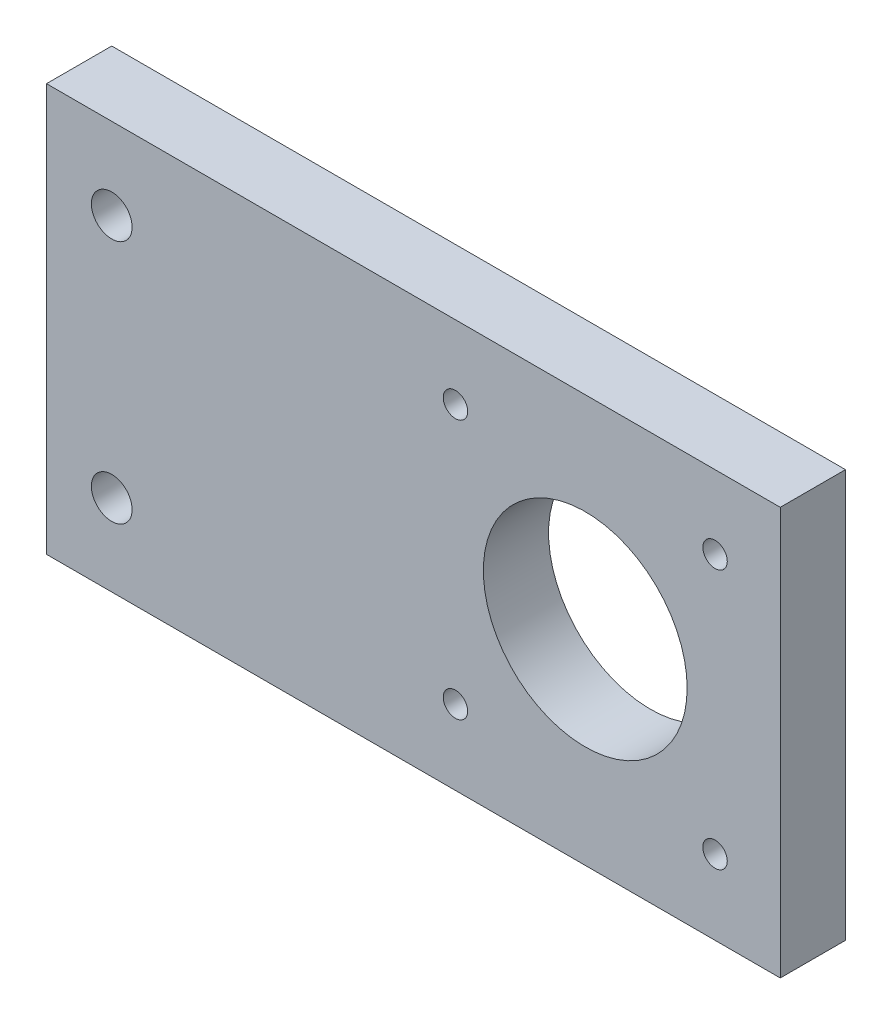
ISO-10303-21;
HEADER;
FILE_DESCRIPTION(('STEP AP214'),'2;1');
FILE_NAME('part.step','',(''),(''),'','','');
FILE_SCHEMA(('AUTOMOTIVE_DESIGN { 1 0 10303 214 1 1 1 1 }'));
ENDSEC;
DATA;
#1=APPLICATION_CONTEXT('core data for automotive mechanical design processes');
#2=APPLICATION_PROTOCOL_DEFINITION('international standard','automotive_design',2000,#1);
#3=PRODUCT_CONTEXT('',#1,'mechanical');
#4=PRODUCT('Part','Part','',(#3));
#5=PRODUCT_RELATED_PRODUCT_CATEGORY('part','',(#4));
#6=PRODUCT_DEFINITION_FORMATION('','',#4);
#7=PRODUCT_DEFINITION_CONTEXT('part definition',#1,'design');
#8=PRODUCT_DEFINITION('design','',#6,#7);
#9=PRODUCT_DEFINITION_SHAPE('','',#8);
#10=(LENGTH_UNIT() NAMED_UNIT(*) SI_UNIT(.MILLI.,.METRE.));
#11=(NAMED_UNIT(*) PLANE_ANGLE_UNIT() SI_UNIT($,.RADIAN.));
#12=(NAMED_UNIT(*) SI_UNIT($,.STERADIAN.) SOLID_ANGLE_UNIT());
#13=UNCERTAINTY_MEASURE_WITH_UNIT(LENGTH_MEASURE(1.E-05),#10,'distance_accuracy_value','');
#14=(GEOMETRIC_REPRESENTATION_CONTEXT(3) GLOBAL_UNCERTAINTY_ASSIGNED_CONTEXT((#13)) GLOBAL_UNIT_ASSIGNED_CONTEXT((#10,
#11,#12)) REPRESENTATION_CONTEXT('',''));
#15=CARTESIAN_POINT('',(0.,0.,0.));
#16=DIRECTION('',(0.,0.,1.));
#17=DIRECTION('',(1.,0.,0.));
#18=AXIS2_PLACEMENT_3D('',#15,#16,#17);
#19=CARTESIAN_POINT('',(44.9999999999999,-25.,8.));
#20=DIRECTION('',(-1.,0.,0.));
#21=DIRECTION('',(0.,0.,1.));
#22=AXIS2_PLACEMENT_3D('',#19,#20,#21);
#23=PLANE('',#22);
#24=DIRECTION('',(0.,1.,0.));
#25=VECTOR('',#24,1.);
#26=CARTESIAN_POINT('',(44.9999999999999,-25.,0.));
#27=LINE('',#26,#25);
#28=CARTESIAN_POINT('',(44.9999999999999,-25.,0.));
#29=VERTEX_POINT('',#28);
#30=CARTESIAN_POINT('',(44.9999999999999,25.,0.));
#31=VERTEX_POINT('',#30);
#32=EDGE_CURVE('E105',#29,#31,#27,.T.);
#33=ORIENTED_EDGE('',*,*,#32,.T.);
#34=DIRECTION('',(0.,0.,-1.));
#35=VECTOR('',#34,1.);
#36=CARTESIAN_POINT('',(44.9999999999999,25.,8.));
#37=LINE('',#36,#35);
#38=CARTESIAN_POINT('',(44.9999999999999,25.,8.));
#39=VERTEX_POINT('',#38);
#40=EDGE_CURVE('E11',#39,#31,#37,.T.);
#41=ORIENTED_EDGE('',*,*,#40,.F.);
#42=DIRECTION('',(0.,1.,0.));
#43=VECTOR('',#42,1.);
#44=CARTESIAN_POINT('',(44.9999999999999,-25.,8.));
#45=LINE('',#44,#43);
#46=CARTESIAN_POINT('',(44.9999999999999,-25.,8.));
#47=VERTEX_POINT('',#46);
#48=EDGE_CURVE('E88',#47,#39,#45,.T.);
#49=ORIENTED_EDGE('',*,*,#48,.F.);
#50=DIRECTION('',(0.,0.,-1.));
#51=VECTOR('',#50,1.);
#52=CARTESIAN_POINT('',(44.9999999999999,-25.,8.));
#53=LINE('',#52,#51);
#54=EDGE_CURVE('E101',#47,#29,#53,.T.);
#55=ORIENTED_EDGE('',*,*,#54,.T.);
#56=EDGE_LOOP('',(#33,#41,#49,#55));
#57=FACE_BOUND('',#56,.T.);
#58=ADVANCED_FACE('F36',(#57),#23,.F.);
#59=CARTESIAN_POINT('',(-45.,25.,8.));
#60=DIRECTION('',(0.,-1.,0.));
#61=DIRECTION('',(0.,0.,-1.));
#62=AXIS2_PLACEMENT_3D('',#59,#60,#61);
#63=PLANE('',#62);
#64=DIRECTION('',(-1.,0.,0.));
#65=VECTOR('',#64,1.);
#66=CARTESIAN_POINT('',(-45.,25.,0.));
#67=LINE('',#66,#65);
#68=CARTESIAN_POINT('',(-45.,25.,0.));
#69=VERTEX_POINT('',#68);
#70=EDGE_CURVE('E93',#31,#69,#67,.T.);
#71=ORIENTED_EDGE('',*,*,#70,.T.);
#72=DIRECTION('',(0.,0.,-1.));
#73=VECTOR('',#72,1.);
#74=CARTESIAN_POINT('',(-45.,25.,8.));
#75=LINE('',#74,#73);
#76=CARTESIAN_POINT('',(-45.,25.,8.));
#77=VERTEX_POINT('',#76);
#78=EDGE_CURVE('E45',#77,#69,#75,.T.);
#79=ORIENTED_EDGE('',*,*,#78,.F.);
#80=DIRECTION('',(-1.,0.,0.));
#81=VECTOR('',#80,1.);
#82=CARTESIAN_POINT('',(-45.,25.,8.));
#83=LINE('',#82,#81);
#84=EDGE_CURVE('E83',#39,#77,#83,.T.);
#85=ORIENTED_EDGE('',*,*,#84,.F.);
#86=ORIENTED_EDGE('',*,*,#40,.T.);
#87=EDGE_LOOP('',(#71,#79,#85,#86));
#88=FACE_BOUND('',#87,.T.);
#89=ADVANCED_FACE('F92',(#88),#63,.F.);
#90=CARTESIAN_POINT('',(-45.,-25.,8.));
#91=DIRECTION('',(1.,0.,0.));
#92=DIRECTION('',(0.,0.,-1.));
#93=AXIS2_PLACEMENT_3D('',#90,#91,#92);
#94=PLANE('',#93);
#95=DIRECTION('',(0.,-1.,0.));
#96=VECTOR('',#95,1.);
#97=CARTESIAN_POINT('',(-45.,-25.,0.));
#98=LINE('',#97,#96);
#99=CARTESIAN_POINT('',(-45.,-25.,0.));
#100=VERTEX_POINT('',#99);
#101=EDGE_CURVE('E70',#69,#100,#98,.T.);
#102=ORIENTED_EDGE('',*,*,#101,.T.);
#103=DIRECTION('',(0.,0.,-1.));
#104=VECTOR('',#103,1.);
#105=CARTESIAN_POINT('',(-45.,-25.,8.));
#106=LINE('',#105,#104);
#107=CARTESIAN_POINT('',(-45.,-25.,8.));
#108=VERTEX_POINT('',#107);
#109=EDGE_CURVE('E95',#108,#100,#106,.T.);
#110=ORIENTED_EDGE('',*,*,#109,.F.);
#111=DIRECTION('',(0.,-1.,0.));
#112=VECTOR('',#111,1.);
#113=CARTESIAN_POINT('',(-45.,-25.,8.));
#114=LINE('',#113,#112);
#115=EDGE_CURVE('E86',#77,#108,#114,.T.);
#116=ORIENTED_EDGE('',*,*,#115,.F.);
#117=ORIENTED_EDGE('',*,*,#78,.T.);
#118=EDGE_LOOP('',(#102,#110,#116,#117));
#119=FACE_BOUND('',#118,.T.);
#120=ADVANCED_FACE('F96',(#119),#94,.F.);
#121=CARTESIAN_POINT('',(-45.,-25.,8.));
#122=DIRECTION('',(0.,1.,0.));
#123=DIRECTION('',(0.,0.,1.));
#124=AXIS2_PLACEMENT_3D('',#121,#122,#123);
#125=PLANE('',#124);
#126=DIRECTION('',(1.,0.,0.));
#127=VECTOR('',#126,1.);
#128=CARTESIAN_POINT('',(-45.,-25.,0.));
#129=LINE('',#128,#127);
#130=EDGE_CURVE('E76',#100,#29,#129,.T.);
#131=ORIENTED_EDGE('',*,*,#130,.T.);
#132=ORIENTED_EDGE('',*,*,#54,.F.);
#133=DIRECTION('',(1.,0.,0.));
#134=VECTOR('',#133,1.);
#135=CARTESIAN_POINT('',(-45.,-25.,8.));
#136=LINE('',#135,#134);
#137=EDGE_CURVE('E53',#108,#47,#136,.T.);
#138=ORIENTED_EDGE('',*,*,#137,.F.);
#139=ORIENTED_EDGE('',*,*,#109,.T.);
#140=EDGE_LOOP('',(#131,#132,#138,#139));
#141=FACE_BOUND('',#140,.T.);
#142=ADVANCED_FACE('F120',(#141),#125,.F.);
#143=CARTESIAN_POINT('',(0.,0.,8.));
#144=DIRECTION('',(0.,0.,-1.));
#145=DIRECTION('',(-1.,0.,0.));
#146=AXIS2_PLACEMENT_3D('',#143,#144,#145);
#147=PLANE('',#146);
#148=CARTESIAN_POINT('',(36.9999999999999,16.,8.));
#149=DIRECTION('',(0.,0.,1.));
#150=DIRECTION('',(1.,0.,0.));
#151=AXIS2_PLACEMENT_3D('',#148,#149,#150);
#152=CIRCLE('',#151,1.5);
#153=CARTESIAN_POINT('',(38.4999999999999,16.,8.));
#154=VERTEX_POINT('',#153);
#155=EDGE_CURVE('E154',#154,#154,#152,.T.);
#156=ORIENTED_EDGE('',*,*,#155,.F.);
#157=EDGE_LOOP('',(#156));
#158=FACE_BOUND('',#157,.T.);
#159=CARTESIAN_POINT('',(5.15999999999993,-15.84,8.));
#160=DIRECTION('',(0.,0.,1.));
#161=DIRECTION('',(1.,0.,0.));
#162=AXIS2_PLACEMENT_3D('',#159,#160,#161);
#163=CIRCLE('',#162,1.5);
#164=CARTESIAN_POINT('',(6.65999999999993,-15.84,8.));
#165=VERTEX_POINT('',#164);
#166=EDGE_CURVE('E140',#165,#165,#163,.T.);
#167=ORIENTED_EDGE('',*,*,#166,.F.);
#168=EDGE_LOOP('',(#167));
#169=FACE_BOUND('',#168,.T.);
#170=CARTESIAN_POINT('',(-37.,-15.,8.));
#171=DIRECTION('',(0.,0.,1.));
#172=DIRECTION('',(1.,0.,0.));
#173=AXIS2_PLACEMENT_3D('',#170,#171,#172);
#174=CIRCLE('',#173,2.5);
#175=CARTESIAN_POINT('',(-34.5,-15.,8.));
#176=VERTEX_POINT('',#175);
#177=EDGE_CURVE('E139',#176,#176,#174,.T.);
#178=ORIENTED_EDGE('',*,*,#177,.F.);
#179=EDGE_LOOP('',(#178));
#180=FACE_BOUND('',#179,.T.);
#181=CARTESIAN_POINT('',(36.9999999999999,-15.84,8.));
#182=DIRECTION('',(0.,0.,1.));
#183=DIRECTION('',(1.,0.,0.));
#184=AXIS2_PLACEMENT_3D('',#181,#182,#183);
#185=CIRCLE('',#184,1.5);
#186=CARTESIAN_POINT('',(38.4999999999999,-15.84,8.));
#187=VERTEX_POINT('',#186);
#188=EDGE_CURVE('E132',#187,#187,#185,.T.);
#189=ORIENTED_EDGE('',*,*,#188,.F.);
#190=EDGE_LOOP('',(#189));
#191=FACE_BOUND('',#190,.T.);
#192=CARTESIAN_POINT('',(5.15999999999993,16.,8.));
#193=DIRECTION('',(0.,0.,1.));
#194=DIRECTION('',(1.,0.,0.));
#195=AXIS2_PLACEMENT_3D('',#192,#193,#194);
#196=CIRCLE('',#195,1.5);
#197=CARTESIAN_POINT('',(6.65999999999993,16.,8.));
#198=VERTEX_POINT('',#197);
#199=EDGE_CURVE('E155',#198,#198,#196,.T.);
#200=ORIENTED_EDGE('',*,*,#199,.F.);
#201=EDGE_LOOP('',(#200));
#202=FACE_BOUND('',#201,.T.);
#203=CARTESIAN_POINT('',(-37.,15.,8.));
#204=DIRECTION('',(0.,0.,1.));
#205=DIRECTION('',(1.,0.,0.));
#206=AXIS2_PLACEMENT_3D('',#203,#204,#205);
#207=CIRCLE('',#206,2.5);
#208=CARTESIAN_POINT('',(-34.5,15.,8.));
#209=VERTEX_POINT('',#208);
#210=EDGE_CURVE('E170',#209,#209,#207,.T.);
#211=ORIENTED_EDGE('',*,*,#210,.F.);
#212=EDGE_LOOP('',(#211));
#213=FACE_BOUND('',#212,.T.);
#214=CARTESIAN_POINT('',(21.0799999999999,0.0799999999999668,8.));
#215=DIRECTION('',(0.,0.,1.));
#216=DIRECTION('',(1.,0.,0.));
#217=AXIS2_PLACEMENT_3D('',#214,#215,#216);
#218=CIRCLE('',#217,12.5);
#219=CARTESIAN_POINT('',(33.5799999999999,0.0799999999999668,8.));
#220=VERTEX_POINT('',#219);
#221=EDGE_CURVE('E128',#220,#220,#218,.T.);
#222=ORIENTED_EDGE('',*,*,#221,.F.);
#223=EDGE_LOOP('',(#222));
#224=FACE_BOUND('',#223,.T.);
#225=ORIENTED_EDGE('',*,*,#48,.T.);
#226=ORIENTED_EDGE('',*,*,#84,.T.);
#227=ORIENTED_EDGE('',*,*,#115,.T.);
#228=ORIENTED_EDGE('',*,*,#137,.T.);
#229=EDGE_LOOP('',(#225,#226,#227,#228));
#230=FACE_BOUND('',#229,.T.);
#231=ADVANCED_FACE('F84',(#158,#169,#180,#191,#202,#213,#224,#230),#147,.F.);
#232=CARTESIAN_POINT('',(0.,0.,0.));
#233=DIRECTION('',(0.,0.,-1.));
#234=DIRECTION('',(-1.,0.,0.));
#235=AXIS2_PLACEMENT_3D('',#232,#233,#234);
#236=PLANE('',#235);
#237=CARTESIAN_POINT('',(36.9999999999999,16.,0.));
#238=DIRECTION('',(0.,0.,1.));
#239=DIRECTION('',(1.,0.,0.));
#240=AXIS2_PLACEMENT_3D('',#237,#238,#239);
#241=CIRCLE('',#240,1.5);
#242=CARTESIAN_POINT('',(38.4999999999999,16.,0.));
#243=VERTEX_POINT('',#242);
#244=EDGE_CURVE('E150',#243,#243,#241,.T.);
#245=ORIENTED_EDGE('',*,*,#244,.T.);
#246=EDGE_LOOP('',(#245));
#247=FACE_BOUND('',#246,.T.);
#248=CARTESIAN_POINT('',(5.15999999999993,-15.84,0.));
#249=DIRECTION('',(0.,0.,1.));
#250=DIRECTION('',(1.,0.,0.));
#251=AXIS2_PLACEMENT_3D('',#248,#249,#250);
#252=CIRCLE('',#251,1.5);
#253=CARTESIAN_POINT('',(6.65999999999993,-15.84,0.));
#254=VERTEX_POINT('',#253);
#255=EDGE_CURVE('E159',#254,#254,#252,.T.);
#256=ORIENTED_EDGE('',*,*,#255,.T.);
#257=EDGE_LOOP('',(#256));
#258=FACE_BOUND('',#257,.T.);
#259=CARTESIAN_POINT('',(-37.,-15.,0.));
#260=DIRECTION('',(0.,0.,1.));
#261=DIRECTION('',(1.,0.,0.));
#262=AXIS2_PLACEMENT_3D('',#259,#260,#261);
#263=CIRCLE('',#262,2.5);
#264=CARTESIAN_POINT('',(-34.5,-15.,0.));
#265=VERTEX_POINT('',#264);
#266=EDGE_CURVE('E135',#265,#265,#263,.T.);
#267=ORIENTED_EDGE('',*,*,#266,.T.);
#268=EDGE_LOOP('',(#267));
#269=FACE_BOUND('',#268,.T.);
#270=CARTESIAN_POINT('',(36.9999999999999,-15.84,0.));
#271=DIRECTION('',(0.,0.,1.));
#272=DIRECTION('',(1.,0.,0.));
#273=AXIS2_PLACEMENT_3D('',#270,#271,#272);
#274=CIRCLE('',#273,1.5);
#275=CARTESIAN_POINT('',(38.4999999999999,-15.84,0.));
#276=VERTEX_POINT('',#275);
#277=EDGE_CURVE('E143',#276,#276,#274,.T.);
#278=ORIENTED_EDGE('',*,*,#277,.T.);
#279=EDGE_LOOP('',(#278));
#280=FACE_BOUND('',#279,.T.);
#281=CARTESIAN_POINT('',(5.15999999999993,16.,0.));
#282=DIRECTION('',(0.,0.,1.));
#283=DIRECTION('',(1.,0.,0.));
#284=AXIS2_PLACEMENT_3D('',#281,#282,#283);
#285=CIRCLE('',#284,1.5);
#286=CARTESIAN_POINT('',(6.65999999999993,16.,0.));
#287=VERTEX_POINT('',#286);
#288=EDGE_CURVE('E174',#287,#287,#285,.T.);
#289=ORIENTED_EDGE('',*,*,#288,.T.);
#290=EDGE_LOOP('',(#289));
#291=FACE_BOUND('',#290,.T.);
#292=CARTESIAN_POINT('',(-37.,15.,0.));
#293=DIRECTION('',(0.,0.,1.));
#294=DIRECTION('',(1.,0.,0.));
#295=AXIS2_PLACEMENT_3D('',#292,#293,#294);
#296=CIRCLE('',#295,2.5);
#297=CARTESIAN_POINT('',(-34.5,15.,0.));
#298=VERTEX_POINT('',#297);
#299=EDGE_CURVE('E166',#298,#298,#296,.T.);
#300=ORIENTED_EDGE('',*,*,#299,.T.);
#301=EDGE_LOOP('',(#300));
#302=FACE_BOUND('',#301,.T.);
#303=CARTESIAN_POINT('',(21.0799999999999,0.0799999999999668,0.));
#304=DIRECTION('',(0.,0.,1.));
#305=DIRECTION('',(1.,0.,0.));
#306=AXIS2_PLACEMENT_3D('',#303,#304,#305);
#307=CIRCLE('',#306,12.5);
#308=CARTESIAN_POINT('',(33.5799999999999,0.0799999999999668,0.));
#309=VERTEX_POINT('',#308);
#310=EDGE_CURVE('E109',#309,#309,#307,.T.);
#311=ORIENTED_EDGE('',*,*,#310,.T.);
#312=EDGE_LOOP('',(#311));
#313=FACE_BOUND('',#312,.T.);
#314=ORIENTED_EDGE('',*,*,#32,.F.);
#315=ORIENTED_EDGE('',*,*,#130,.F.);
#316=ORIENTED_EDGE('',*,*,#101,.F.);
#317=ORIENTED_EDGE('',*,*,#70,.F.);
#318=EDGE_LOOP('',(#314,#315,#316,#317));
#319=FACE_BOUND('',#318,.T.);
#320=ADVANCED_FACE('F123',(#247,#258,#269,#280,#291,#302,#313,#319),#236,.T.);
#321=CARTESIAN_POINT('',(21.0799999999999,0.0799999999999668,0.));
#322=DIRECTION('',(0.,0.,1.));
#323=DIRECTION('',(1.,0.,0.));
#324=AXIS2_PLACEMENT_3D('',#321,#322,#323);
#325=CYLINDRICAL_SURFACE('',#324,12.5);
#326=ORIENTED_EDGE('',*,*,#310,.F.);
#327=EDGE_LOOP('',(#326));
#328=FACE_BOUND('',#327,.T.);
#329=ORIENTED_EDGE('',*,*,#221,.T.);
#330=EDGE_LOOP('',(#329));
#331=FACE_BOUND('',#330,.T.);
#332=ADVANCED_FACE('F191',(#328,#331),#325,.F.);
#333=CARTESIAN_POINT('',(-37.,15.,0.));
#334=DIRECTION('',(0.,0.,1.));
#335=DIRECTION('',(1.,0.,0.));
#336=AXIS2_PLACEMENT_3D('',#333,#334,#335);
#337=CYLINDRICAL_SURFACE('',#336,2.5);
#338=ORIENTED_EDGE('',*,*,#299,.F.);
#339=EDGE_LOOP('',(#338));
#340=FACE_BOUND('',#339,.T.);
#341=ORIENTED_EDGE('',*,*,#210,.T.);
#342=EDGE_LOOP('',(#341));
#343=FACE_BOUND('',#342,.T.);
#344=ADVANCED_FACE('F193',(#340,#343),#337,.F.);
#345=CARTESIAN_POINT('',(5.15999999999993,16.,0.));
#346=DIRECTION('',(0.,0.,1.));
#347=DIRECTION('',(1.,0.,0.));
#348=AXIS2_PLACEMENT_3D('',#345,#346,#347);
#349=CYLINDRICAL_SURFACE('',#348,1.5);
#350=ORIENTED_EDGE('',*,*,#288,.F.);
#351=EDGE_LOOP('',(#350));
#352=FACE_BOUND('',#351,.T.);
#353=ORIENTED_EDGE('',*,*,#199,.T.);
#354=EDGE_LOOP('',(#353));
#355=FACE_BOUND('',#354,.T.);
#356=ADVANCED_FACE('F181',(#352,#355),#349,.F.);
#357=CARTESIAN_POINT('',(36.9999999999999,-15.84,0.));
#358=DIRECTION('',(0.,0.,1.));
#359=DIRECTION('',(1.,0.,0.));
#360=AXIS2_PLACEMENT_3D('',#357,#358,#359);
#361=CYLINDRICAL_SURFACE('',#360,1.5);
#362=ORIENTED_EDGE('',*,*,#277,.F.);
#363=EDGE_LOOP('',(#362));
#364=FACE_BOUND('',#363,.T.);
#365=ORIENTED_EDGE('',*,*,#188,.T.);
#366=EDGE_LOOP('',(#365));
#367=FACE_BOUND('',#366,.T.);
#368=ADVANCED_FACE('F241',(#364,#367),#361,.F.);
#369=CARTESIAN_POINT('',(-37.,-15.,0.));
#370=DIRECTION('',(0.,0.,1.));
#371=DIRECTION('',(1.,0.,0.));
#372=AXIS2_PLACEMENT_3D('',#369,#370,#371);
#373=CYLINDRICAL_SURFACE('',#372,2.5);
#374=ORIENTED_EDGE('',*,*,#266,.F.);
#375=EDGE_LOOP('',(#374));
#376=FACE_BOUND('',#375,.T.);
#377=ORIENTED_EDGE('',*,*,#177,.T.);
#378=EDGE_LOOP('',(#377));
#379=FACE_BOUND('',#378,.T.);
#380=ADVANCED_FACE('F250',(#376,#379),#373,.F.);
#381=CARTESIAN_POINT('',(5.15999999999993,-15.84,0.));
#382=DIRECTION('',(0.,0.,1.));
#383=DIRECTION('',(1.,0.,0.));
#384=AXIS2_PLACEMENT_3D('',#381,#382,#383);
#385=CYLINDRICAL_SURFACE('',#384,1.5);
#386=ORIENTED_EDGE('',*,*,#255,.F.);
#387=EDGE_LOOP('',(#386));
#388=FACE_BOUND('',#387,.T.);
#389=ORIENTED_EDGE('',*,*,#166,.T.);
#390=EDGE_LOOP('',(#389));
#391=FACE_BOUND('',#390,.T.);
#392=ADVANCED_FACE('F259',(#388,#391),#385,.F.);
#393=CARTESIAN_POINT('',(36.9999999999999,16.,0.));
#394=DIRECTION('',(0.,0.,1.));
#395=DIRECTION('',(1.,0.,0.));
#396=AXIS2_PLACEMENT_3D('',#393,#394,#395);
#397=CYLINDRICAL_SURFACE('',#396,1.5);
#398=ORIENTED_EDGE('',*,*,#244,.F.);
#399=EDGE_LOOP('',(#398));
#400=FACE_BOUND('',#399,.T.);
#401=ORIENTED_EDGE('',*,*,#155,.T.);
#402=EDGE_LOOP('',(#401));
#403=FACE_BOUND('',#402,.T.);
#404=ADVANCED_FACE('F267',(#400,#403),#397,.F.);
#405=CLOSED_SHELL('',(#58,#89,#120,#142,#231,#320,#332,#344,#356,#368,#380,#392,#404));
#406=MANIFOLD_SOLID_BREP('B2',#405);
#407=ADVANCED_BREP_SHAPE_REPRESENTATION('',(#18,#406),#14);
#408=SHAPE_DEFINITION_REPRESENTATION(#9,#407);
ENDSEC;
END-ISO-10303-21;
